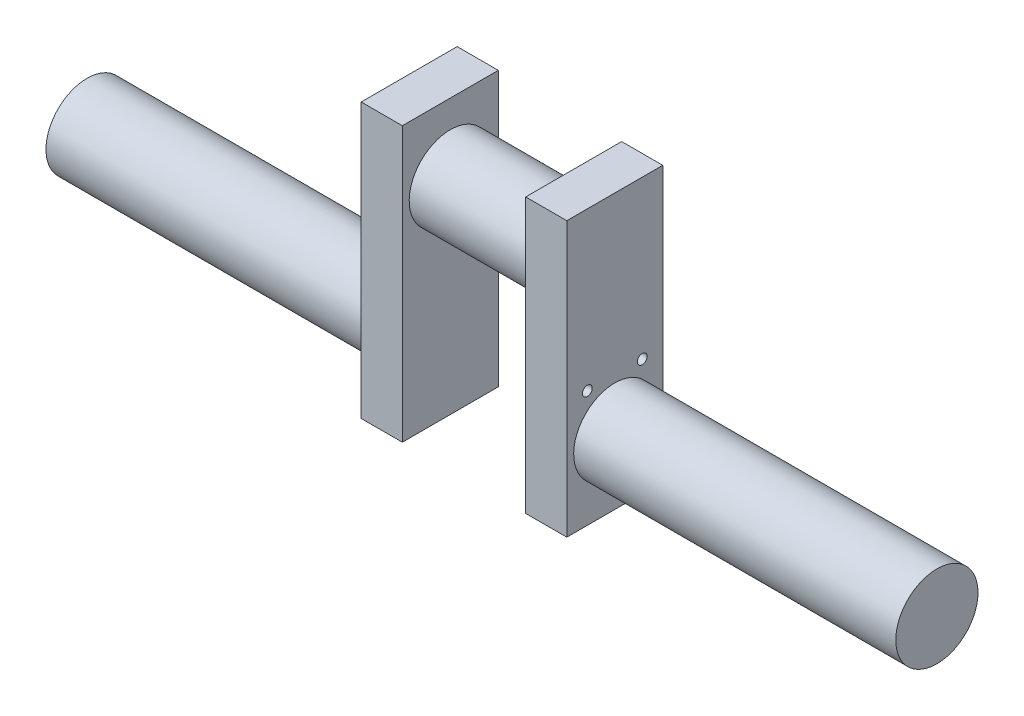
ISO-10303-21;
HEADER;
FILE_DESCRIPTION(('STEP AP214'),'2;1');
FILE_NAME('part.step','',(''),(''),'','','');
FILE_SCHEMA(('AUTOMOTIVE_DESIGN { 1 0 10303 214 1 1 1 1 }'));
ENDSEC;
DATA;
#1=APPLICATION_CONTEXT('core data for automotive mechanical design processes');
#2=APPLICATION_PROTOCOL_DEFINITION('international standard','automotive_design',2000,#1);
#3=PRODUCT_CONTEXT('',#1,'mechanical');
#4=PRODUCT('Part','Part','',(#3));
#5=PRODUCT_RELATED_PRODUCT_CATEGORY('part','',(#4));
#6=PRODUCT_DEFINITION_FORMATION('','',#4);
#7=PRODUCT_DEFINITION_CONTEXT('part definition',#1,'design');
#8=PRODUCT_DEFINITION('design','',#6,#7);
#9=PRODUCT_DEFINITION_SHAPE('','',#8);
#10=(LENGTH_UNIT() NAMED_UNIT(*) SI_UNIT(.MILLI.,.METRE.));
#11=(NAMED_UNIT(*) PLANE_ANGLE_UNIT() SI_UNIT($,.RADIAN.));
#12=(NAMED_UNIT(*) SI_UNIT($,.STERADIAN.) SOLID_ANGLE_UNIT());
#13=UNCERTAINTY_MEASURE_WITH_UNIT(LENGTH_MEASURE(1.E-05),#10,'distance_accuracy_value','');
#14=(GEOMETRIC_REPRESENTATION_CONTEXT(3) GLOBAL_UNCERTAINTY_ASSIGNED_CONTEXT((#13)) GLOBAL_UNIT_ASSIGNED_CONTEXT((#10,
#11,#12)) REPRESENTATION_CONTEXT('',''));
#15=CARTESIAN_POINT('',(0.,0.,0.));
#16=DIRECTION('',(0.,0.,1.));
#17=DIRECTION('',(1.,0.,0.));
#18=AXIS2_PLACEMENT_3D('',#15,#16,#17);
#19=CARTESIAN_POINT('',(-23.8125,50.8241892371066,22.225));
#20=DIRECTION('',(0.,-1.,0.));
#21=DIRECTION('',(0.,0.,-1.));
#22=AXIS2_PLACEMENT_3D('',#19,#20,#21);
#23=PLANE('',#22);
#24=DIRECTION('',(-1.,0.,0.));
#25=VECTOR('',#24,1.);
#26=CARTESIAN_POINT('',(-23.8125,50.8241892371066,0.));
#27=LINE('',#26,#25);
#28=CARTESIAN_POINT('',(-14.2875,50.8241892371066,0.));
#29=VERTEX_POINT('',#28);
#30=CARTESIAN_POINT('',(-23.8125,50.8241892371066,0.));
#31=VERTEX_POINT('',#30);
#32=EDGE_CURVE('E180',#29,#31,#27,.T.);
#33=ORIENTED_EDGE('',*,*,#32,.T.);
#34=DIRECTION('',(0.,0.,-1.));
#35=VECTOR('',#34,1.);
#36=CARTESIAN_POINT('',(-23.8125,50.8241892371066,22.225));
#37=LINE('',#36,#35);
#38=CARTESIAN_POINT('',(-23.8125,50.8241892371066,22.225));
#39=VERTEX_POINT('',#38);
#40=EDGE_CURVE('E199',#39,#31,#37,.T.);
#41=ORIENTED_EDGE('',*,*,#40,.F.);
#42=DIRECTION('',(-1.,0.,0.));
#43=VECTOR('',#42,1.);
#44=CARTESIAN_POINT('',(-23.8125,50.8241892371066,22.225));
#45=LINE('',#44,#43);
#46=CARTESIAN_POINT('',(-14.2875,50.8241892371066,22.225));
#47=VERTEX_POINT('',#46);
#48=EDGE_CURVE('E181',#47,#39,#45,.T.);
#49=ORIENTED_EDGE('',*,*,#48,.F.);
#50=DIRECTION('',(0.,0.,-1.));
#51=VECTOR('',#50,1.);
#52=CARTESIAN_POINT('',(-14.2875,50.8241892371066,22.225));
#53=LINE('',#52,#51);
#54=EDGE_CURVE('E187',#47,#29,#53,.T.);
#55=ORIENTED_EDGE('',*,*,#54,.T.);
#56=EDGE_LOOP('',(#33,#41,#49,#55));
#57=FACE_BOUND('',#56,.T.);
#58=ADVANCED_FACE('F38',(#57),#23,.F.);
#59=CARTESIAN_POINT('',(-23.8125,50.8241892371066,22.225));
#60=DIRECTION('',(1.,0.,0.));
#61=DIRECTION('',(0.,1.,0.));
#62=AXIS2_PLACEMENT_3D('',#59,#60,#61);
#63=PLANE('',#62);
#64=CARTESIAN_POINT('',(-23.8125,3.19918923710657,11.1125));
#65=DIRECTION('',(1.,0.,0.));
#66=DIRECTION('',(0.,1.,0.));
#67=AXIS2_PLACEMENT_3D('',#64,#65,#66);
#68=CIRCLE('',#67,9.525);
#69=CARTESIAN_POINT('',(-23.8125,12.7241892371066,11.1125));
#70=VERTEX_POINT('',#69);
#71=EDGE_CURVE('E138',#70,#70,#68,.T.);
#72=ORIENTED_EDGE('',*,*,#71,.T.);
#73=EDGE_LOOP('',(#72));
#74=FACE_BOUND('',#73,.T.);
#75=DIRECTION('',(0.,-1.,0.));
#76=VECTOR('',#75,1.);
#77=CARTESIAN_POINT('',(-23.8125,50.8241892371066,0.));
#78=LINE('',#77,#76);
#79=CARTESIAN_POINT('',(-23.8125,-12.6758107628934,0.));
#80=VERTEX_POINT('',#79);
#81=EDGE_CURVE('E190',#31,#80,#78,.T.);
#82=ORIENTED_EDGE('',*,*,#81,.T.);
#83=DIRECTION('',(0.,0.,-1.));
#84=VECTOR('',#83,1.);
#85=CARTESIAN_POINT('',(-23.8125,-12.6758107628934,22.225));
#86=LINE('',#85,#84);
#87=CARTESIAN_POINT('',(-23.8125,-12.6758107628934,22.225));
#88=VERTEX_POINT('',#87);
#89=EDGE_CURVE('E197',#88,#80,#86,.T.);
#90=ORIENTED_EDGE('',*,*,#89,.F.);
#91=DIRECTION('',(0.,-1.,0.));
#92=VECTOR('',#91,1.);
#93=CARTESIAN_POINT('',(-23.8125,50.8241892371066,22.225));
#94=LINE('',#93,#92);
#95=EDGE_CURVE('E86',#39,#88,#94,.T.);
#96=ORIENTED_EDGE('',*,*,#95,.F.);
#97=ORIENTED_EDGE('',*,*,#40,.T.);
#98=EDGE_LOOP('',(#82,#90,#96,#97));
#99=FACE_BOUND('',#98,.T.);
#100=ADVANCED_FACE('F217',(#74,#99),#63,.F.);
#101=CARTESIAN_POINT('',(-14.2875,-12.6758107628934,22.225));
#102=DIRECTION('',(0.,1.,0.));
#103=DIRECTION('',(-1.,0.,0.));
#104=AXIS2_PLACEMENT_3D('',#101,#102,#103);
#105=PLANE('',#104);
#106=DIRECTION('',(1.,0.,0.));
#107=VECTOR('',#106,1.);
#108=CARTESIAN_POINT('',(-14.2875,-12.6758107628934,0.));
#109=LINE('',#108,#107);
#110=CARTESIAN_POINT('',(-14.2875,-12.6758107628934,0.));
#111=VERTEX_POINT('',#110);
#112=EDGE_CURVE('E72',#80,#111,#109,.T.);
#113=ORIENTED_EDGE('',*,*,#112,.T.);
#114=DIRECTION('',(0.,0.,-1.));
#115=VECTOR('',#114,1.);
#116=CARTESIAN_POINT('',(-14.2875,-12.6758107628934,22.225));
#117=LINE('',#116,#115);
#118=CARTESIAN_POINT('',(-14.2875,-12.6758107628934,22.225));
#119=VERTEX_POINT('',#118);
#120=EDGE_CURVE('E195',#119,#111,#117,.T.);
#121=ORIENTED_EDGE('',*,*,#120,.F.);
#122=DIRECTION('',(1.,0.,0.));
#123=VECTOR('',#122,1.);
#124=CARTESIAN_POINT('',(-14.2875,-12.6758107628934,22.225));
#125=LINE('',#124,#123);
#126=EDGE_CURVE('E184',#88,#119,#125,.T.);
#127=ORIENTED_EDGE('',*,*,#126,.F.);
#128=ORIENTED_EDGE('',*,*,#89,.T.);
#129=EDGE_LOOP('',(#113,#121,#127,#128));
#130=FACE_BOUND('',#129,.T.);
#131=ADVANCED_FACE('F209',(#130),#105,.F.);
#132=CARTESIAN_POINT('',(-14.2875,50.8241892371066,22.225));
#133=DIRECTION('',(-1.,0.,0.));
#134=DIRECTION('',(0.,-1.,0.));
#135=AXIS2_PLACEMENT_3D('',#132,#133,#134);
#136=PLANE('',#135);
#137=CARTESIAN_POINT('',(-14.2875,34.9491892371066,11.1125));
#138=DIRECTION('',(-1.,0.,0.));
#139=DIRECTION('',(0.,-1.,0.));
#140=AXIS2_PLACEMENT_3D('',#137,#138,#139);
#141=CIRCLE('',#140,9.525);
#142=CARTESIAN_POINT('',(-14.2875,25.4241892371066,11.1125));
#143=VERTEX_POINT('',#142);
#144=EDGE_CURVE('E46',#143,#143,#141,.F.);
#145=ORIENTED_EDGE('',*,*,#144,.F.);
#146=EDGE_LOOP('',(#145));
#147=FACE_BOUND('',#146,.T.);
#148=DIRECTION('',(0.,1.,0.));
#149=VECTOR('',#148,1.);
#150=CARTESIAN_POINT('',(-14.2875,50.8241892371066,0.));
#151=LINE('',#150,#149);
#152=EDGE_CURVE('E78',#111,#29,#151,.T.);
#153=ORIENTED_EDGE('',*,*,#152,.T.);
#154=ORIENTED_EDGE('',*,*,#54,.F.);
#155=DIRECTION('',(0.,1.,0.));
#156=VECTOR('',#155,1.);
#157=CARTESIAN_POINT('',(-14.2875,50.8241892371066,22.225));
#158=LINE('',#157,#156);
#159=EDGE_CURVE('E54',#119,#47,#158,.T.);
#160=ORIENTED_EDGE('',*,*,#159,.F.);
#161=ORIENTED_EDGE('',*,*,#120,.T.);
#162=EDGE_LOOP('',(#153,#154,#160,#161));
#163=FACE_BOUND('',#162,.T.);
#164=ADVANCED_FACE('F206',(#147,#163),#136,.F.);
#165=CARTESIAN_POINT('',(0.,0.,22.225));
#166=DIRECTION('',(0.,0.,-1.));
#167=DIRECTION('',(-1.,0.,0.));
#168=AXIS2_PLACEMENT_3D('',#165,#166,#167);
#169=PLANE('',#168);
#170=ORIENTED_EDGE('',*,*,#48,.T.);
#171=ORIENTED_EDGE('',*,*,#95,.T.);
#172=ORIENTED_EDGE('',*,*,#126,.T.);
#173=ORIENTED_EDGE('',*,*,#159,.T.);
#174=EDGE_LOOP('',(#170,#171,#172,#173));
#175=FACE_BOUND('',#174,.T.);
#176=ADVANCED_FACE('F208',(#175),#169,.F.);
#177=CARTESIAN_POINT('',(0.,0.,0.));
#178=DIRECTION('',(0.,0.,-1.));
#179=DIRECTION('',(-1.,0.,0.));
#180=AXIS2_PLACEMENT_3D('',#177,#178,#179);
#181=PLANE('',#180);
#182=ORIENTED_EDGE('',*,*,#32,.F.);
#183=ORIENTED_EDGE('',*,*,#152,.F.);
#184=ORIENTED_EDGE('',*,*,#112,.F.);
#185=ORIENTED_EDGE('',*,*,#81,.F.);
#186=EDGE_LOOP('',(#182,#183,#184,#185));
#187=FACE_BOUND('',#186,.T.);
#188=ADVANCED_FACE('F215',(#187),#181,.T.);
#189=CARTESIAN_POINT('',(23.8145,34.9491892371066,11.1125));
#190=DIRECTION('',(-1.,0.,0.));
#191=DIRECTION('',(0.,-1.,0.));
#192=AXIS2_PLACEMENT_3D('',#189,#190,#191);
#193=CYLINDRICAL_SURFACE('',#192,9.525);
#194=ORIENTED_EDGE('',*,*,#144,.T.);
#195=EDGE_LOOP('',(#194));
#196=FACE_BOUND('',#195,.T.);
#197=CARTESIAN_POINT('',(14.2875,34.9491892371066,11.1125));
#198=DIRECTION('',(1.,0.,0.));
#199=DIRECTION('',(0.,1.,0.));
#200=AXIS2_PLACEMENT_3D('',#197,#198,#199);
#201=CIRCLE('',#200,9.525);
#202=CARTESIAN_POINT('',(14.2875,44.4741892371066,11.1125));
#203=VERTEX_POINT('',#202);
#204=EDGE_CURVE('E177',#203,#203,#201,.T.);
#205=ORIENTED_EDGE('',*,*,#204,.F.);
#206=EDGE_LOOP('',(#205));
#207=FACE_BOUND('',#206,.T.);
#208=ADVANCED_FACE('F203',(#196,#207),#193,.T.);
#209=CARTESIAN_POINT('',(14.2875,50.8241892371066,22.225));
#210=DIRECTION('',(1.,0.,0.));
#211=DIRECTION('',(0.,1.,0.));
#212=AXIS2_PLACEMENT_3D('',#209,#210,#211);
#213=PLANE('',#212);
#214=ORIENTED_EDGE('',*,*,#204,.T.);
#215=EDGE_LOOP('',(#214));
#216=FACE_BOUND('',#215,.T.);
#217=DIRECTION('',(0.,-1.,0.));
#218=VECTOR('',#217,1.);
#219=CARTESIAN_POINT('',(14.2875,50.8241892371066,0.));
#220=LINE('',#219,#218);
#221=CARTESIAN_POINT('',(14.2875,50.8241892371066,0.));
#222=VERTEX_POINT('',#221);
#223=CARTESIAN_POINT('',(14.2875,-12.6758107628934,0.));
#224=VERTEX_POINT('',#223);
#225=EDGE_CURVE('E147',#222,#224,#220,.T.);
#226=ORIENTED_EDGE('',*,*,#225,.T.);
#227=DIRECTION('',(0.,0.,-1.));
#228=VECTOR('',#227,1.);
#229=CARTESIAN_POINT('',(14.2875,-12.6758107628934,22.225));
#230=LINE('',#229,#228);
#231=CARTESIAN_POINT('',(14.2875,-12.6758107628934,22.225));
#232=VERTEX_POINT('',#231);
#233=EDGE_CURVE('E174',#232,#224,#230,.T.);
#234=ORIENTED_EDGE('',*,*,#233,.F.);
#235=DIRECTION('',(0.,-1.,0.));
#236=VECTOR('',#235,1.);
#237=CARTESIAN_POINT('',(14.2875,50.8241892371066,22.225));
#238=LINE('',#237,#236);
#239=CARTESIAN_POINT('',(14.2875,50.8241892371066,22.225));
#240=VERTEX_POINT('',#239);
#241=EDGE_CURVE('E148',#240,#232,#238,.T.);
#242=ORIENTED_EDGE('',*,*,#241,.F.);
#243=DIRECTION('',(0.,0.,-1.));
#244=VECTOR('',#243,1.);
#245=CARTESIAN_POINT('',(14.2875,50.8241892371066,22.225));
#246=LINE('',#245,#244);
#247=EDGE_CURVE('E158',#240,#222,#246,.T.);
#248=ORIENTED_EDGE('',*,*,#247,.T.);
#249=EDGE_LOOP('',(#226,#234,#242,#248));
#250=FACE_BOUND('',#249,.T.);
#251=ADVANCED_FACE('F235',(#216,#250),#213,.F.);
#252=CARTESIAN_POINT('',(14.2875,-12.6758107628934,22.225));
#253=DIRECTION('',(0.,1.,0.));
#254=DIRECTION('',(-1.,0.,0.));
#255=AXIS2_PLACEMENT_3D('',#252,#253,#254);
#256=PLANE('',#255);
#257=DIRECTION('',(1.,0.,0.));
#258=VECTOR('',#257,1.);
#259=CARTESIAN_POINT('',(14.2875,-12.6758107628934,0.));
#260=LINE('',#259,#258);
#261=CARTESIAN_POINT('',(23.8125,-12.6758107628934,0.));
#262=VERTEX_POINT('',#261);
#263=EDGE_CURVE('E161',#224,#262,#260,.T.);
#264=ORIENTED_EDGE('',*,*,#263,.T.);
#265=DIRECTION('',(0.,0.,-1.));
#266=VECTOR('',#265,1.);
#267=CARTESIAN_POINT('',(23.8125,-12.6758107628934,22.225));
#268=LINE('',#267,#266);
#269=CARTESIAN_POINT('',(23.8125,-12.6758107628934,22.225));
#270=VERTEX_POINT('',#269);
#271=EDGE_CURVE('E171',#270,#262,#268,.T.);
#272=ORIENTED_EDGE('',*,*,#271,.F.);
#273=DIRECTION('',(1.,0.,0.));
#274=VECTOR('',#273,1.);
#275=CARTESIAN_POINT('',(14.2875,-12.6758107628934,22.225));
#276=LINE('',#275,#274);
#277=EDGE_CURVE('E151',#232,#270,#276,.T.);
#278=ORIENTED_EDGE('',*,*,#277,.F.);
#279=ORIENTED_EDGE('',*,*,#233,.T.);
#280=EDGE_LOOP('',(#264,#272,#278,#279));
#281=FACE_BOUND('',#280,.T.);
#282=ADVANCED_FACE('F240',(#281),#256,.F.);
#283=CARTESIAN_POINT('',(23.8125,50.8241892371066,22.225));
#284=DIRECTION('',(-1.,0.,0.));
#285=DIRECTION('',(0.,-1.,0.));
#286=AXIS2_PLACEMENT_3D('',#283,#284,#285);
#287=PLANE('',#286);
#288=CARTESIAN_POINT('',(23.8125,14.3116892371066,4.7625));
#289=DIRECTION('',(1.,0.,0.));
#290=DIRECTION('',(0.,0.,-1.));
#291=AXIS2_PLACEMENT_3D('',#288,#289,#290);
#292=CIRCLE('',#291,1.1303);
#293=CARTESIAN_POINT('',(23.8125,14.3116892371066,3.6322));
#294=VERTEX_POINT('',#293);
#295=EDGE_CURVE('E128',#294,#294,#292,.T.);
#296=ORIENTED_EDGE('',*,*,#295,.F.);
#297=EDGE_LOOP('',(#296));
#298=FACE_BOUND('',#297,.T.);
#299=CARTESIAN_POINT('',(23.8125,14.3116892371066,17.4625));
#300=DIRECTION('',(1.,0.,0.));
#301=DIRECTION('',(0.,0.,-1.));
#302=AXIS2_PLACEMENT_3D('',#299,#300,#301);
#303=CIRCLE('',#302,1.1303);
#304=CARTESIAN_POINT('',(23.8125,14.3116892371066,16.3322));
#305=VERTEX_POINT('',#304);
#306=EDGE_CURVE('E127',#305,#305,#303,.T.);
#307=ORIENTED_EDGE('',*,*,#306,.F.);
#308=EDGE_LOOP('',(#307));
#309=FACE_BOUND('',#308,.T.);
#310=CARTESIAN_POINT('',(23.8125,3.19918923710657,11.1125));
#311=DIRECTION('',(-1.,0.,0.));
#312=DIRECTION('',(0.,-1.,0.));
#313=AXIS2_PLACEMENT_3D('',#310,#311,#312);
#314=CIRCLE('',#313,9.525);
#315=CARTESIAN_POINT('',(23.8125,-6.32581076289343,11.1125));
#316=VERTEX_POINT('',#315);
#317=EDGE_CURVE('E11',#316,#316,#314,.F.);
#318=ORIENTED_EDGE('',*,*,#317,.F.);
#319=EDGE_LOOP('',(#318));
#320=FACE_BOUND('',#319,.T.);
#321=DIRECTION('',(0.,1.,0.));
#322=VECTOR('',#321,1.);
#323=CARTESIAN_POINT('',(23.8125,50.8241892371066,0.));
#324=LINE('',#323,#322);
#325=CARTESIAN_POINT('',(23.8125,50.8241892371066,0.));
#326=VERTEX_POINT('',#325);
#327=EDGE_CURVE('E163',#262,#326,#324,.T.);
#328=ORIENTED_EDGE('',*,*,#327,.T.);
#329=DIRECTION('',(0.,0.,-1.));
#330=VECTOR('',#329,1.);
#331=CARTESIAN_POINT('',(23.8125,50.8241892371066,22.225));
#332=LINE('',#331,#330);
#333=CARTESIAN_POINT('',(23.8125,50.8241892371066,22.225));
#334=VERTEX_POINT('',#333);
#335=EDGE_CURVE('E168',#334,#326,#332,.T.);
#336=ORIENTED_EDGE('',*,*,#335,.F.);
#337=DIRECTION('',(0.,1.,0.));
#338=VECTOR('',#337,1.);
#339=CARTESIAN_POINT('',(23.8125,50.8241892371066,22.225));
#340=LINE('',#339,#338);
#341=EDGE_CURVE('E154',#270,#334,#340,.T.);
#342=ORIENTED_EDGE('',*,*,#341,.F.);
#343=ORIENTED_EDGE('',*,*,#271,.T.);
#344=EDGE_LOOP('',(#328,#336,#342,#343));
#345=FACE_BOUND('',#344,.T.);
#346=ADVANCED_FACE('F244',(#298,#309,#320,#345),#287,.F.);
#347=CARTESIAN_POINT('',(23.8125,50.8241892371066,22.225));
#348=DIRECTION('',(0.,-1.,0.));
#349=DIRECTION('',(0.,0.,-1.));
#350=AXIS2_PLACEMENT_3D('',#347,#348,#349);
#351=PLANE('',#350);
#352=DIRECTION('',(-1.,0.,0.));
#353=VECTOR('',#352,1.);
#354=CARTESIAN_POINT('',(23.8125,50.8241892371066,0.));
#355=LINE('',#354,#353);
#356=EDGE_CURVE('E152',#326,#222,#355,.T.);
#357=ORIENTED_EDGE('',*,*,#356,.T.);
#358=ORIENTED_EDGE('',*,*,#247,.F.);
#359=DIRECTION('',(-1.,0.,0.));
#360=VECTOR('',#359,1.);
#361=CARTESIAN_POINT('',(23.8125,50.8241892371066,22.225));
#362=LINE('',#361,#360);
#363=EDGE_CURVE('E156',#334,#240,#362,.T.);
#364=ORIENTED_EDGE('',*,*,#363,.F.);
#365=ORIENTED_EDGE('',*,*,#335,.T.);
#366=EDGE_LOOP('',(#357,#358,#364,#365));
#367=FACE_BOUND('',#366,.T.);
#368=ADVANCED_FACE('F248',(#367),#351,.F.);
#369=CARTESIAN_POINT('',(0.,0.,22.225));
#370=DIRECTION('',(0.,0.,1.));
#371=DIRECTION('',(1.,0.,0.));
#372=AXIS2_PLACEMENT_3D('',#369,#370,#371);
#373=PLANE('',#372);
#374=ORIENTED_EDGE('',*,*,#241,.T.);
#375=ORIENTED_EDGE('',*,*,#277,.T.);
#376=ORIENTED_EDGE('',*,*,#341,.T.);
#377=ORIENTED_EDGE('',*,*,#363,.T.);
#378=EDGE_LOOP('',(#374,#375,#376,#377));
#379=FACE_BOUND('',#378,.T.);
#380=ADVANCED_FACE('F252',(#379),#373,.T.);
#381=CARTESIAN_POINT('',(0.,0.,0.));
#382=DIRECTION('',(0.,0.,1.));
#383=DIRECTION('',(1.,0.,0.));
#384=AXIS2_PLACEMENT_3D('',#381,#382,#383);
#385=PLANE('',#384);
#386=ORIENTED_EDGE('',*,*,#225,.F.);
#387=ORIENTED_EDGE('',*,*,#356,.F.);
#388=ORIENTED_EDGE('',*,*,#327,.F.);
#389=ORIENTED_EDGE('',*,*,#263,.F.);
#390=EDGE_LOOP('',(#386,#387,#388,#389));
#391=FACE_BOUND('',#390,.T.);
#392=ADVANCED_FACE('F254',(#391),#385,.F.);
#393=CARTESIAN_POINT('',(98.425,3.19918923710658,11.1125));
#394=DIRECTION('',(-1.,0.,0.));
#395=DIRECTION('',(0.,-1.,0.));
#396=AXIS2_PLACEMENT_3D('',#393,#394,#395);
#397=CYLINDRICAL_SURFACE('',#396,9.525);
#398=CARTESIAN_POINT('',(98.425,3.19918923710658,11.1125));
#399=DIRECTION('',(1.,0.,0.));
#400=DIRECTION('',(0.,1.,0.));
#401=AXIS2_PLACEMENT_3D('',#398,#399,#400);
#402=CIRCLE('',#401,9.525);
#403=CARTESIAN_POINT('',(98.425,12.7241892371066,11.1125));
#404=VERTEX_POINT('',#403);
#405=EDGE_CURVE('E142',#404,#404,#402,.T.);
#406=ORIENTED_EDGE('',*,*,#405,.F.);
#407=EDGE_LOOP('',(#406));
#408=FACE_BOUND('',#407,.T.);
#409=ORIENTED_EDGE('',*,*,#317,.T.);
#410=EDGE_LOOP('',(#409));
#411=FACE_BOUND('',#410,.T.);
#412=ADVANCED_FACE('F257',(#408,#411),#397,.T.);
#413=CARTESIAN_POINT('',(98.425,3.19918923710658,11.1125));
#414=DIRECTION('',(1.,0.,0.));
#415=DIRECTION('',(0.,1.,0.));
#416=AXIS2_PLACEMENT_3D('',#413,#414,#415);
#417=PLANE('',#416);
#418=ORIENTED_EDGE('',*,*,#405,.T.);
#419=EDGE_LOOP('',(#418));
#420=FACE_BOUND('',#419,.T.);
#421=ADVANCED_FACE('F264',(#420),#417,.T.);
#422=CARTESIAN_POINT('',(-98.425,3.19918923710658,11.1125));
#423=DIRECTION('',(1.,0.,0.));
#424=DIRECTION('',(0.,1.,0.));
#425=AXIS2_PLACEMENT_3D('',#422,#423,#424);
#426=CYLINDRICAL_SURFACE('',#425,9.525);
#427=CARTESIAN_POINT('',(-98.425,3.19918923710658,11.1125));
#428=DIRECTION('',(1.,0.,0.));
#429=DIRECTION('',(0.,1.,0.));
#430=AXIS2_PLACEMENT_3D('',#427,#428,#429);
#431=CIRCLE('',#430,9.525);
#432=CARTESIAN_POINT('',(-98.425,12.7241892371066,11.1125));
#433=VERTEX_POINT('',#432);
#434=EDGE_CURVE('E139',#433,#433,#431,.T.);
#435=ORIENTED_EDGE('',*,*,#434,.T.);
#436=EDGE_LOOP('',(#435));
#437=FACE_BOUND('',#436,.T.);
#438=ORIENTED_EDGE('',*,*,#71,.F.);
#439=EDGE_LOOP('',(#438));
#440=FACE_BOUND('',#439,.T.);
#441=ADVANCED_FACE('F268',(#437,#440),#426,.T.);
#442=CARTESIAN_POINT('',(-98.425,3.19918923710658,11.1125));
#443=DIRECTION('',(-1.,0.,0.));
#444=DIRECTION('',(0.,1.,0.));
#445=AXIS2_PLACEMENT_3D('',#442,#443,#444);
#446=PLANE('',#445);
#447=ORIENTED_EDGE('',*,*,#434,.F.);
#448=EDGE_LOOP('',(#447));
#449=FACE_BOUND('',#448,.T.);
#450=ADVANCED_FACE('F272',(#449),#446,.T.);
#451=CARTESIAN_POINT('',(17.4625,14.3116892371066,17.4625));
#452=DIRECTION('',(1.,0.,0.));
#453=DIRECTION('',(0.,0.,-1.));
#454=AXIS2_PLACEMENT_3D('',#451,#452,#453);
#455=CONICAL_SURFACE('',#454,1.1303,1.02974425867665);
#456=CARTESIAN_POINT('',(16.7833472423131,14.3116892371066,17.4625));
#457=VERTEX_POINT('',#456);
#458=VERTEX_LOOP('',#457);
#459=FACE_BOUND('',#458,.T.);
#460=CARTESIAN_POINT('',(17.4625,14.3116892371066,17.4625));
#461=DIRECTION('',(1.,0.,0.));
#462=DIRECTION('',(0.,0.,-1.));
#463=AXIS2_PLACEMENT_3D('',#460,#461,#462);
#464=CIRCLE('',#463,1.1303);
#465=CARTESIAN_POINT('',(17.4625,14.3116892371066,16.3322));
#466=VERTEX_POINT('',#465);
#467=EDGE_CURVE('E131',#466,#466,#464,.T.);
#468=ORIENTED_EDGE('',*,*,#467,.T.);
#469=EDGE_LOOP('',(#468));
#470=FACE_BOUND('',#469,.T.);
#471=ADVANCED_FACE('F276',(#459,#470),#455,.F.);
#472=CARTESIAN_POINT('',(23.8125,14.3116892371066,17.4625));
#473=DIRECTION('',(1.,0.,0.));
#474=DIRECTION('',(0.,0.,-1.));
#475=AXIS2_PLACEMENT_3D('',#472,#473,#474);
#476=CYLINDRICAL_SURFACE('',#475,1.1303);
#477=ORIENTED_EDGE('',*,*,#467,.F.);
#478=EDGE_LOOP('',(#477));
#479=FACE_BOUND('',#478,.T.);
#480=ORIENTED_EDGE('',*,*,#306,.T.);
#481=EDGE_LOOP('',(#480));
#482=FACE_BOUND('',#481,.T.);
#483=ADVANCED_FACE('F121',(#479,#482),#476,.F.);
#484=CARTESIAN_POINT('',(17.4625,14.3116892371066,4.7625));
#485=DIRECTION('',(1.,0.,0.));
#486=DIRECTION('',(0.,0.,-1.));
#487=AXIS2_PLACEMENT_3D('',#484,#485,#486);
#488=CONICAL_SURFACE('',#487,1.1303,1.02974425867665);
#489=CARTESIAN_POINT('',(16.7833472423131,14.3116892371066,4.7625));
#490=VERTEX_POINT('',#489);
#491=VERTEX_LOOP('',#490);
#492=FACE_BOUND('',#491,.T.);
#493=CARTESIAN_POINT('',(17.4625,14.3116892371066,4.7625));
#494=DIRECTION('',(1.,0.,0.));
#495=DIRECTION('',(0.,0.,-1.));
#496=AXIS2_PLACEMENT_3D('',#493,#494,#495);
#497=CIRCLE('',#496,1.1303);
#498=CARTESIAN_POINT('',(17.4625,14.3116892371066,3.6322));
#499=VERTEX_POINT('',#498);
#500=EDGE_CURVE('E125',#499,#499,#497,.T.);
#501=ORIENTED_EDGE('',*,*,#500,.T.);
#502=EDGE_LOOP('',(#501));
#503=FACE_BOUND('',#502,.T.);
#504=ADVANCED_FACE('F117',(#492,#503),#488,.F.);
#505=CARTESIAN_POINT('',(23.8125,14.3116892371066,4.7625));
#506=DIRECTION('',(1.,0.,0.));
#507=DIRECTION('',(0.,0.,-1.));
#508=AXIS2_PLACEMENT_3D('',#505,#506,#507);
#509=CYLINDRICAL_SURFACE('',#508,1.1303);
#510=ORIENTED_EDGE('',*,*,#500,.F.);
#511=EDGE_LOOP('',(#510));
#512=FACE_BOUND('',#511,.T.);
#513=ORIENTED_EDGE('',*,*,#295,.T.);
#514=EDGE_LOOP('',(#513));
#515=FACE_BOUND('',#514,.T.);
#516=ADVANCED_FACE('F120',(#512,#515),#509,.F.);
#517=CLOSED_SHELL('',(#58,#100,#131,#164,#176,#188,#208,#251,#282,#346,#368,#380,#392,#412,#421,
#441,#450,#471,#483,#504,#516));
#518=MANIFOLD_SOLID_BREP('B2',#517);
#519=ADVANCED_BREP_SHAPE_REPRESENTATION('',(#18,#518),#14);
#520=SHAPE_DEFINITION_REPRESENTATION(#9,#519);
ENDSEC;
END-ISO-10303-21;
